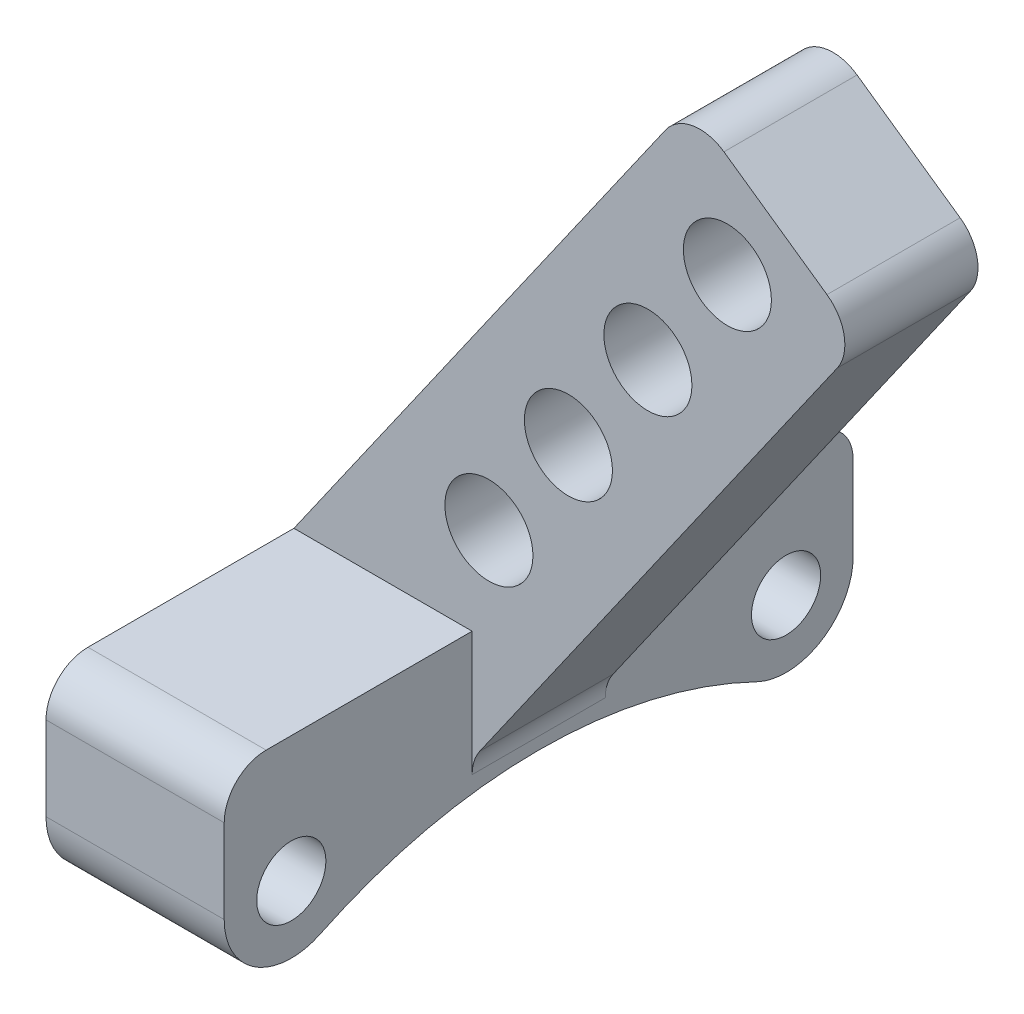
ISO-10303-21;
HEADER;
FILE_DESCRIPTION(('STEP AP214'),'2;1');
FILE_NAME('part.step','',(''),(''),'','','');
FILE_SCHEMA(('AUTOMOTIVE_DESIGN { 1 0 10303 214 1 1 1 1 }'));
ENDSEC;
DATA;
#1=APPLICATION_CONTEXT('core data for automotive mechanical design processes');
#2=APPLICATION_PROTOCOL_DEFINITION('international standard','automotive_design',2000,#1);
#3=PRODUCT_CONTEXT('',#1,'mechanical');
#4=PRODUCT('Part','Part','',(#3));
#5=PRODUCT_RELATED_PRODUCT_CATEGORY('part','',(#4));
#6=PRODUCT_DEFINITION_FORMATION('','',#4);
#7=PRODUCT_DEFINITION_CONTEXT('part definition',#1,'design');
#8=PRODUCT_DEFINITION('design','',#6,#7);
#9=PRODUCT_DEFINITION_SHAPE('','',#8);
#10=(LENGTH_UNIT() NAMED_UNIT(*) SI_UNIT(.MILLI.,.METRE.));
#11=(NAMED_UNIT(*) PLANE_ANGLE_UNIT() SI_UNIT($,.RADIAN.));
#12=(NAMED_UNIT(*) SI_UNIT($,.STERADIAN.) SOLID_ANGLE_UNIT());
#13=UNCERTAINTY_MEASURE_WITH_UNIT(LENGTH_MEASURE(1.E-05),#10,'distance_accuracy_value','');
#14=(GEOMETRIC_REPRESENTATION_CONTEXT(3) GLOBAL_UNCERTAINTY_ASSIGNED_CONTEXT((#13)) GLOBAL_UNIT_ASSIGNED_CONTEXT((#10,
#11,#12)) REPRESENTATION_CONTEXT('',''));
#15=CARTESIAN_POINT('',(0.,0.,0.));
#16=DIRECTION('',(0.,0.,1.));
#17=DIRECTION('',(1.,0.,0.));
#18=AXIS2_PLACEMENT_3D('',#15,#16,#17);
#19=CARTESIAN_POINT('',(8.5,6.,0.));
#20=DIRECTION('',(0.,1.,0.));
#21=DIRECTION('',(0.,0.,1.));
#22=AXIS2_PLACEMENT_3D('',#19,#20,#21);
#23=PLANE('',#22);
#24=DIRECTION('',(0.,0.,-1.));
#25=VECTOR('',#24,1.);
#26=CARTESIAN_POINT('',(8.5,6.,0.));
#27=LINE('',#26,#25);
#28=CARTESIAN_POINT('',(8.5,6.,13.));
#29=VERTEX_POINT('',#28);
#30=CARTESIAN_POINT('',(8.5,6.,3.175));
#31=VERTEX_POINT('',#30);
#32=EDGE_CURVE('E186',#29,#31,#27,.T.);
#33=ORIENTED_EDGE('',*,*,#32,.T.);
#34=DIRECTION('',(-1.,0.,0.));
#35=VECTOR('',#34,1.);
#36=CARTESIAN_POINT('',(8.5,6.,3.175));
#37=LINE('',#36,#35);
#38=CARTESIAN_POINT('',(0.,6.,3.175));
#39=VERTEX_POINT('',#38);
#40=EDGE_CURVE('E196',#31,#39,#37,.T.);
#41=ORIENTED_EDGE('',*,*,#40,.T.);
#42=DIRECTION('',(0.,0.,-1.));
#43=VECTOR('',#42,1.);
#44=CARTESIAN_POINT('',(0.,6.,0.));
#45=LINE('',#44,#43);
#46=CARTESIAN_POINT('',(0.,6.,13.));
#47=VERTEX_POINT('',#46);
#48=EDGE_CURVE('E200',#47,#39,#45,.T.);
#49=ORIENTED_EDGE('',*,*,#48,.F.);
#50=DIRECTION('',(-1.,0.,0.));
#51=VECTOR('',#50,1.);
#52=CARTESIAN_POINT('',(8.5,6.,13.));
#53=LINE('',#52,#51);
#54=EDGE_CURVE('E215',#29,#47,#53,.T.);
#55=ORIENTED_EDGE('',*,*,#54,.F.);
#56=EDGE_LOOP('',(#33,#41,#49,#55));
#57=FACE_BOUND('',#56,.T.);
#58=ADVANCED_FACE('F41',(#57),#23,.T.);
#59=CARTESIAN_POINT('',(8.5,0.,0.));
#60=DIRECTION('',(1.,0.,0.));
#61=DIRECTION('',(0.,0.,-1.));
#62=AXIS2_PLACEMENT_3D('',#59,#60,#61);
#63=PLANE('',#62);
#64=CARTESIAN_POINT('',(8.5,0.,11.8));
#65=DIRECTION('',(-1.,0.,0.));
#66=DIRECTION('',(0.,0.,1.));
#67=AXIS2_PLACEMENT_3D('',#64,#65,#66);
#68=CIRCLE('',#67,3.19999999999999);
#69=CARTESIAN_POINT('',(8.5,-2.88159421278918,10.4084487818194));
#70=VERTEX_POINT('',#69);
#71=CARTESIAN_POINT('',(8.5,0.,15.));
#72=VERTEX_POINT('',#71);
#73=EDGE_CURVE('E153',#70,#72,#68,.T.);
#74=ORIENTED_EDGE('',*,*,#73,.F.);
#75=CARTESIAN_POINT('',(8.5,-24.4351851851853,0.));
#76=DIRECTION('',(1.,0.,0.));
#77=DIRECTION('',(0.,0.,1.));
#78=AXIS2_PLACEMENT_3D('',#75,#76,#77);
#79=CIRCLE('',#78,23.9351851851853);
#80=CARTESIAN_POINT('',(8.5,-2.88159421278918,-10.4084487818194));
#81=VERTEX_POINT('',#80);
#82=EDGE_CURVE('E173',#81,#70,#79,.T.);
#83=ORIENTED_EDGE('',*,*,#82,.F.);
#84=CARTESIAN_POINT('',(8.5,0.,-11.8));
#85=DIRECTION('',(-1.,0.,0.));
#86=DIRECTION('',(0.,0.,1.));
#87=AXIS2_PLACEMENT_3D('',#84,#85,#86);
#88=CIRCLE('',#87,3.19999999999999);
#89=CARTESIAN_POINT('',(8.5,0.,-15.));
#90=VERTEX_POINT('',#89);
#91=EDGE_CURVE('E163',#90,#81,#88,.T.);
#92=ORIENTED_EDGE('',*,*,#91,.F.);
#93=DIRECTION('',(0.,1.,0.));
#94=VECTOR('',#93,1.);
#95=CARTESIAN_POINT('',(8.5,0.,-15.));
#96=LINE('',#95,#94);
#97=CARTESIAN_POINT('',(8.5,4.,-15.));
#98=VERTEX_POINT('',#97);
#99=EDGE_CURVE('E213',#90,#98,#96,.T.);
#100=ORIENTED_EDGE('',*,*,#99,.T.);
#101=CARTESIAN_POINT('',(8.5,4.,-13.));
#102=DIRECTION('',(1.,0.,0.));
#103=DIRECTION('',(0.,0.,-1.));
#104=AXIS2_PLACEMENT_3D('',#101,#102,#103);
#105=CIRCLE('',#104,2.);
#106=CARTESIAN_POINT('',(8.5,6.,-13.));
#107=VERTEX_POINT('',#106);
#108=EDGE_CURVE('E317',#98,#107,#105,.T.);
#109=ORIENTED_EDGE('',*,*,#108,.T.);
#110=CARTESIAN_POINT('',(8.5,6.,-3.175));
#111=VERTEX_POINT('',#110);
#112=EDGE_CURVE('E319',#111,#107,#27,.T.);
#113=ORIENTED_EDGE('',*,*,#112,.F.);
#114=DIRECTION('',(0.,1.,0.));
#115=VECTOR('',#114,1.);
#116=CARTESIAN_POINT('',(8.5,0.,-3.175));
#117=LINE('',#116,#115);
#118=CARTESIAN_POINT('',(8.5,0.0741925233390714,-3.175));
#119=VERTEX_POINT('',#118);
#120=EDGE_CURVE('E306',#119,#111,#117,.T.);
#121=ORIENTED_EDGE('',*,*,#120,.F.);
#122=DIRECTION('',(0.,0.,1.));
#123=VECTOR('',#122,1.);
#124=CARTESIAN_POINT('',(8.5,0.0741925233390714,0.));
#125=LINE('',#124,#123);
#126=CARTESIAN_POINT('',(8.5,0.0741925233390714,3.175));
#127=VERTEX_POINT('',#126);
#128=EDGE_CURVE('E223',#119,#127,#125,.T.);
#129=ORIENTED_EDGE('',*,*,#128,.T.);
#130=DIRECTION('',(0.,1.,0.));
#131=VECTOR('',#130,1.);
#132=CARTESIAN_POINT('',(8.5,0.,3.175));
#133=LINE('',#132,#131);
#134=EDGE_CURVE('E311',#127,#31,#133,.T.);
#135=ORIENTED_EDGE('',*,*,#134,.T.);
#136=ORIENTED_EDGE('',*,*,#32,.F.);
#137=CARTESIAN_POINT('',(8.5,4.,13.));
#138=DIRECTION('',(1.,0.,0.));
#139=DIRECTION('',(0.,0.,-1.));
#140=AXIS2_PLACEMENT_3D('',#137,#138,#139);
#141=CIRCLE('',#140,2.);
#142=CARTESIAN_POINT('',(8.5,4.,15.));
#143=VERTEX_POINT('',#142);
#144=EDGE_CURVE('E180',#143,#29,#141,.F.);
#145=ORIENTED_EDGE('',*,*,#144,.F.);
#146=DIRECTION('',(0.,1.,0.));
#147=VECTOR('',#146,1.);
#148=CARTESIAN_POINT('',(8.5,0.,15.));
#149=LINE('',#148,#147);
#150=EDGE_CURVE('E169',#72,#143,#149,.T.);
#151=ORIENTED_EDGE('',*,*,#150,.F.);
#152=EDGE_LOOP('',(#74,#83,#92,#100,#109,#113,#121,#129,#135,#136,#145,#151));
#153=FACE_BOUND('',#152,.T.);
#154=CARTESIAN_POINT('',(8.5,0.,-11.8));
#155=DIRECTION('',(1.,0.,0.));
#156=DIRECTION('',(0.,0.,-1.));
#157=AXIS2_PLACEMENT_3D('',#154,#155,#156);
#158=CIRCLE('',#157,1.65);
#159=CARTESIAN_POINT('',(8.5,0.,-13.45));
#160=VERTEX_POINT('',#159);
#161=EDGE_CURVE('E181',#160,#160,#158,.T.);
#162=ORIENTED_EDGE('',*,*,#161,.F.);
#163=EDGE_LOOP('',(#162));
#164=FACE_BOUND('',#163,.T.);
#165=CARTESIAN_POINT('',(8.5,0.,11.8));
#166=DIRECTION('',(1.,0.,0.));
#167=DIRECTION('',(0.,0.,-1.));
#168=AXIS2_PLACEMENT_3D('',#165,#166,#167);
#169=CIRCLE('',#168,1.65);
#170=CARTESIAN_POINT('',(8.5,0.,10.15));
#171=VERTEX_POINT('',#170);
#172=EDGE_CURVE('E184',#171,#171,#169,.T.);
#173=ORIENTED_EDGE('',*,*,#172,.F.);
#174=EDGE_LOOP('',(#173));
#175=FACE_BOUND('',#174,.T.);
#176=ADVANCED_FACE('F176',(#153,#164,#175),#63,.T.);
#177=CARTESIAN_POINT('',(8.5,0.,-15.));
#178=DIRECTION('',(0.,0.,1.));
#179=DIRECTION('',(1.,0.,0.));
#180=AXIS2_PLACEMENT_3D('',#177,#178,#179);
#181=PLANE('',#180);
#182=ORIENTED_EDGE('',*,*,#99,.F.);
#183=DIRECTION('',(1.,0.,0.));
#184=VECTOR('',#183,1.);
#185=CARTESIAN_POINT('',(-1.5,0.,-15.));
#186=LINE('',#185,#184);
#187=CARTESIAN_POINT('',(0.,0.,-15.));
#188=VERTEX_POINT('',#187);
#189=EDGE_CURVE('E172',#188,#90,#186,.T.);
#190=ORIENTED_EDGE('',*,*,#189,.F.);
#191=DIRECTION('',(0.,1.,0.));
#192=VECTOR('',#191,1.);
#193=CARTESIAN_POINT('',(0.,0.,-15.));
#194=LINE('',#193,#192);
#195=CARTESIAN_POINT('',(0.,4.,-15.));
#196=VERTEX_POINT('',#195);
#197=EDGE_CURVE('E193',#188,#196,#194,.T.);
#198=ORIENTED_EDGE('',*,*,#197,.T.);
#199=DIRECTION('',(-1.,0.,0.));
#200=VECTOR('',#199,1.);
#201=CARTESIAN_POINT('',(8.5,4.,-15.));
#202=LINE('',#201,#200);
#203=EDGE_CURVE('E220',#98,#196,#202,.T.);
#204=ORIENTED_EDGE('',*,*,#203,.F.);
#205=EDGE_LOOP('',(#182,#190,#198,#204));
#206=FACE_BOUND('',#205,.T.);
#207=ADVANCED_FACE('F383',(#206),#181,.F.);
#208=CARTESIAN_POINT('',(8.5,4.,-13.));
#209=DIRECTION('',(-1.,0.,0.));
#210=DIRECTION('',(0.,0.,1.));
#211=AXIS2_PLACEMENT_3D('',#208,#209,#210);
#212=CYLINDRICAL_SURFACE('',#211,2.);
#213=CARTESIAN_POINT('',(0.,4.,-13.));
#214=DIRECTION('',(1.,0.,0.));
#215=DIRECTION('',(0.,0.,-1.));
#216=AXIS2_PLACEMENT_3D('',#213,#214,#215);
#217=CIRCLE('',#216,2.);
#218=CARTESIAN_POINT('',(0.,6.,-13.));
#219=VERTEX_POINT('',#218);
#220=EDGE_CURVE('E195',#196,#219,#217,.T.);
#221=ORIENTED_EDGE('',*,*,#220,.T.);
#222=DIRECTION('',(-1.,0.,0.));
#223=VECTOR('',#222,1.);
#224=CARTESIAN_POINT('',(8.5,6.,-13.));
#225=LINE('',#224,#223);
#226=EDGE_CURVE('E217',#107,#219,#225,.T.);
#227=ORIENTED_EDGE('',*,*,#226,.F.);
#228=ORIENTED_EDGE('',*,*,#108,.F.);
#229=ORIENTED_EDGE('',*,*,#203,.T.);
#230=EDGE_LOOP('',(#221,#227,#228,#229));
#231=FACE_BOUND('',#230,.T.);
#232=ADVANCED_FACE('F333',(#231),#212,.T.);
#233=DIRECTION('',(-1.,0.,0.));
#234=VECTOR('',#233,1.);
#235=CARTESIAN_POINT('',(8.5,6.,-3.175));
#236=LINE('',#235,#234);
#237=CARTESIAN_POINT('',(0.,6.,-3.175));
#238=VERTEX_POINT('',#237);
#239=EDGE_CURVE('E308',#111,#238,#236,.T.);
#240=ORIENTED_EDGE('',*,*,#239,.F.);
#241=ORIENTED_EDGE('',*,*,#112,.T.);
#242=ORIENTED_EDGE('',*,*,#226,.T.);
#243=EDGE_CURVE('E199',#238,#219,#45,.T.);
#244=ORIENTED_EDGE('',*,*,#243,.F.);
#245=EDGE_LOOP('',(#240,#241,#242,#244));
#246=FACE_BOUND('',#245,.T.);
#247=ADVANCED_FACE('F325',(#246),#23,.T.);
#248=CARTESIAN_POINT('',(8.5,4.,13.));
#249=DIRECTION('',(-1.,0.,0.));
#250=DIRECTION('',(0.,0.,1.));
#251=AXIS2_PLACEMENT_3D('',#248,#249,#250);
#252=CYLINDRICAL_SURFACE('',#251,2.);
#253=CARTESIAN_POINT('',(0.,4.,13.));
#254=DIRECTION('',(1.,0.,0.));
#255=DIRECTION('',(0.,0.,-1.));
#256=AXIS2_PLACEMENT_3D('',#253,#254,#255);
#257=CIRCLE('',#256,2.);
#258=CARTESIAN_POINT('',(0.,4.,15.));
#259=VERTEX_POINT('',#258);
#260=EDGE_CURVE('E203',#259,#47,#257,.F.);
#261=ORIENTED_EDGE('',*,*,#260,.F.);
#262=DIRECTION('',(-1.,0.,0.));
#263=VECTOR('',#262,1.);
#264=CARTESIAN_POINT('',(8.5,4.,15.));
#265=LINE('',#264,#263);
#266=EDGE_CURVE('E192',#143,#259,#265,.T.);
#267=ORIENTED_EDGE('',*,*,#266,.F.);
#268=ORIENTED_EDGE('',*,*,#144,.T.);
#269=ORIENTED_EDGE('',*,*,#54,.T.);
#270=EDGE_LOOP('',(#261,#267,#268,#269));
#271=FACE_BOUND('',#270,.T.);
#272=ADVANCED_FACE('F388',(#271),#252,.T.);
#273=CARTESIAN_POINT('',(8.5,0.,15.));
#274=DIRECTION('',(0.,0.,1.));
#275=DIRECTION('',(0.,-1.,0.));
#276=AXIS2_PLACEMENT_3D('',#273,#274,#275);
#277=PLANE('',#276);
#278=DIRECTION('',(1.,0.,0.));
#279=VECTOR('',#278,1.);
#280=CARTESIAN_POINT('',(-1.5,0.,15.));
#281=LINE('',#280,#279);
#282=CARTESIAN_POINT('',(0.,0.,15.));
#283=VERTEX_POINT('',#282);
#284=EDGE_CURVE('E156',#283,#72,#281,.T.);
#285=ORIENTED_EDGE('',*,*,#284,.T.);
#286=ORIENTED_EDGE('',*,*,#150,.T.);
#287=ORIENTED_EDGE('',*,*,#266,.T.);
#288=DIRECTION('',(0.,1.,0.));
#289=VECTOR('',#288,1.);
#290=CARTESIAN_POINT('',(0.,0.,15.));
#291=LINE('',#290,#289);
#292=EDGE_CURVE('E171',#283,#259,#291,.T.);
#293=ORIENTED_EDGE('',*,*,#292,.F.);
#294=EDGE_LOOP('',(#285,#286,#287,#293));
#295=FACE_BOUND('',#294,.T.);
#296=ADVANCED_FACE('F167',(#295),#277,.T.);
#297=CARTESIAN_POINT('',(8.5,0.,-11.8));
#298=DIRECTION('',(-1.,0.,0.));
#299=DIRECTION('',(0.,0.,1.));
#300=AXIS2_PLACEMENT_3D('',#297,#298,#299);
#301=CYLINDRICAL_SURFACE('',#300,1.65);
#302=ORIENTED_EDGE('',*,*,#161,.T.);
#303=EDGE_LOOP('',(#302));
#304=FACE_BOUND('',#303,.T.);
#305=CARTESIAN_POINT('',(0.,0.,-11.8));
#306=DIRECTION('',(1.,0.,0.));
#307=DIRECTION('',(0.,0.,-1.));
#308=AXIS2_PLACEMENT_3D('',#305,#306,#307);
#309=CIRCLE('',#308,1.65);
#310=CARTESIAN_POINT('',(0.,0.,-13.45));
#311=VERTEX_POINT('',#310);
#312=EDGE_CURVE('E207',#311,#311,#309,.T.);
#313=ORIENTED_EDGE('',*,*,#312,.F.);
#314=EDGE_LOOP('',(#313));
#315=FACE_BOUND('',#314,.T.);
#316=ADVANCED_FACE('F449',(#304,#315),#301,.F.);
#317=CARTESIAN_POINT('',(8.5,0.,11.8));
#318=DIRECTION('',(-1.,0.,0.));
#319=DIRECTION('',(0.,0.,1.));
#320=AXIS2_PLACEMENT_3D('',#317,#318,#319);
#321=CYLINDRICAL_SURFACE('',#320,1.65);
#322=ORIENTED_EDGE('',*,*,#172,.T.);
#323=EDGE_LOOP('',(#322));
#324=FACE_BOUND('',#323,.T.);
#325=CARTESIAN_POINT('',(0.,0.,11.8));
#326=DIRECTION('',(1.,0.,0.));
#327=DIRECTION('',(0.,0.,-1.));
#328=AXIS2_PLACEMENT_3D('',#325,#326,#327);
#329=CIRCLE('',#328,1.65);
#330=CARTESIAN_POINT('',(0.,0.,10.15));
#331=VERTEX_POINT('',#330);
#332=EDGE_CURVE('E210',#331,#331,#329,.T.);
#333=ORIENTED_EDGE('',*,*,#332,.F.);
#334=EDGE_LOOP('',(#333));
#335=FACE_BOUND('',#334,.T.);
#336=ADVANCED_FACE('F446',(#324,#335),#321,.F.);
#337=CARTESIAN_POINT('',(0.,0.,0.));
#338=DIRECTION('',(1.,0.,0.));
#339=DIRECTION('',(0.,0.,-1.));
#340=AXIS2_PLACEMENT_3D('',#337,#338,#339);
#341=PLANE('',#340);
#342=CARTESIAN_POINT('',(0.,-24.4351851851853,0.));
#343=DIRECTION('',(1.,0.,0.));
#344=DIRECTION('',(0.,0.,-1.));
#345=AXIS2_PLACEMENT_3D('',#342,#343,#344);
#346=CIRCLE('',#345,23.9351851851853);
#347=CARTESIAN_POINT('',(0.,-2.88159421278918,-10.4084487818194));
#348=VERTEX_POINT('',#347);
#349=CARTESIAN_POINT('',(0.,-2.88159421278918,10.4084487818194));
#350=VERTEX_POINT('',#349);
#351=EDGE_CURVE('E49',#348,#350,#346,.T.);
#352=ORIENTED_EDGE('',*,*,#351,.T.);
#353=CARTESIAN_POINT('',(0.,0.,11.8));
#354=DIRECTION('',(1.,0.,0.));
#355=DIRECTION('',(0.,0.,-1.));
#356=AXIS2_PLACEMENT_3D('',#353,#354,#355);
#357=CIRCLE('',#356,3.19999999999999);
#358=EDGE_CURVE('E11',#350,#283,#357,.F.);
#359=ORIENTED_EDGE('',*,*,#358,.T.);
#360=ORIENTED_EDGE('',*,*,#292,.T.);
#361=ORIENTED_EDGE('',*,*,#260,.T.);
#362=ORIENTED_EDGE('',*,*,#48,.T.);
#363=DIRECTION('',(0.,0.,-1.));
#364=VECTOR('',#363,1.);
#365=CARTESIAN_POINT('',(0.,6.,3.175));
#366=LINE('',#365,#364);
#367=EDGE_CURVE('E283',#39,#238,#366,.T.);
#368=ORIENTED_EDGE('',*,*,#367,.T.);
#369=ORIENTED_EDGE('',*,*,#243,.T.);
#370=ORIENTED_EDGE('',*,*,#220,.F.);
#371=ORIENTED_EDGE('',*,*,#197,.F.);
#372=CARTESIAN_POINT('',(0.,0.,-11.8));
#373=DIRECTION('',(1.,0.,0.));
#374=DIRECTION('',(0.,0.,-1.));
#375=AXIS2_PLACEMENT_3D('',#372,#373,#374);
#376=CIRCLE('',#375,3.19999999999999);
#377=EDGE_CURVE('E232',#188,#348,#376,.F.);
#378=ORIENTED_EDGE('',*,*,#377,.T.);
#379=EDGE_LOOP('',(#352,#359,#360,#361,#362,#368,#369,#370,#371,#378));
#380=FACE_BOUND('',#379,.T.);
#381=ORIENTED_EDGE('',*,*,#332,.T.);
#382=EDGE_LOOP('',(#381));
#383=FACE_BOUND('',#382,.T.);
#384=ORIENTED_EDGE('',*,*,#312,.T.);
#385=EDGE_LOOP('',(#384));
#386=FACE_BOUND('',#385,.T.);
#387=ADVANCED_FACE('F236',(#380,#383,#386),#341,.F.);
#388=CARTESIAN_POINT('',(19.3649131176615,30.1690684784805,3.175));
#389=DIRECTION('',(0.,0.,-1.));
#390=DIRECTION('',(-1.,0.,0.));
#391=AXIS2_PLACEMENT_3D('',#388,#389,#390);
#392=PLANE('',#391);
#393=ORIENTED_EDGE('',*,*,#40,.F.);
#394=ORIENTED_EDGE('',*,*,#134,.F.);
#395=CARTESIAN_POINT('',(10.5,0.0741925233390714,3.175));
#396=DIRECTION('',(0.,0.,-1.));
#397=DIRECTION('',(-1.,0.,0.));
#398=AXIS2_PLACEMENT_3D('',#395,#396,#397);
#399=CIRCLE('',#398,2.);
#400=CARTESIAN_POINT('',(8.86169591142201,1.22134539604116,3.175));
#401=VERTEX_POINT('',#400);
#402=EDGE_CURVE('E64',#127,#401,#399,.T.);
#403=ORIENTED_EDGE('',*,*,#402,.T.);
#404=DIRECTION('',(0.573576436351044,0.819152044288993,0.));
#405=VECTOR('',#404,1.);
#406=CARTESIAN_POINT('',(25.9181294719735,25.5804569876722,3.175));
#407=LINE('',#406,#405);
#408=CARTESIAN_POINT('',(25.9181294719735,25.5804569876722,3.175));
#409=VERTEX_POINT('',#408);
#410=EDGE_CURVE('E272',#401,#409,#407,.T.);
#411=ORIENTED_EDGE('',*,*,#410,.T.);
#412=CARTESIAN_POINT('',(24.2798253833955,26.7276098603743,3.175));
#413=DIRECTION('',(0.,0.,1.));
#414=DIRECTION('',(1.,0.,0.));
#415=AXIS2_PLACEMENT_3D('',#412,#413,#414);
#416=CIRCLE('',#415,1.99999999999999);
#417=CARTESIAN_POINT('',(25.4269782560976,28.3659139489522,3.175));
#418=VERTEX_POINT('',#417);
#419=EDGE_CURVE('E274',#409,#418,#416,.T.);
#420=ORIENTED_EDGE('',*,*,#419,.T.);
#421=DIRECTION('',(-0.819152044288993,0.573576436351044,0.));
#422=VECTOR('',#421,1.);
#423=CARTESIAN_POINT('',(25.4269782560976,28.3659139489522,3.175));
#424=LINE('',#423,#422);
#425=CARTESIAN_POINT('',(20.5120659903636,31.8073725670585,3.175));
#426=VERTEX_POINT('',#425);
#427=EDGE_CURVE('E277',#418,#426,#424,.T.);
#428=ORIENTED_EDGE('',*,*,#427,.T.);
#429=CARTESIAN_POINT('',(19.3649131176615,30.1690684784805,3.175));
#430=DIRECTION('',(0.,0.,1.));
#431=DIRECTION('',(-1.,0.,0.));
#432=AXIS2_PLACEMENT_3D('',#429,#430,#431);
#433=CIRCLE('',#432,1.99999999999999);
#434=CARTESIAN_POINT('',(17.7266090290836,31.3162213511826,3.175));
#435=VERTEX_POINT('',#434);
#436=EDGE_CURVE('E279',#426,#435,#433,.T.);
#437=ORIENTED_EDGE('',*,*,#436,.T.);
#438=DIRECTION('',(-0.573576436351044,-0.819152044288993,0.));
#439=VECTOR('',#438,1.);
#440=CARTESIAN_POINT('',(0.,6.,3.175));
#441=LINE('',#440,#439);
#442=EDGE_CURVE('E281',#435,#39,#441,.T.);
#443=ORIENTED_EDGE('',*,*,#442,.T.);
#444=EDGE_LOOP('',(#393,#394,#403,#411,#420,#428,#437,#443));
#445=FACE_BOUND('',#444,.T.);
#446=CARTESIAN_POINT('',(13.0925358892656,15.9808450553489,3.175));
#447=DIRECTION('',(0.,0.,1.));
#448=DIRECTION('',(1.,0.,0.));
#449=AXIS2_PLACEMENT_3D('',#446,#447,#448);
#450=CIRCLE('',#449,2.1);
#451=CARTESIAN_POINT('',(15.1925358892656,15.9808450553489,3.175));
#452=VERTEX_POINT('',#451);
#453=EDGE_CURVE('E266',#452,#452,#450,.T.);
#454=ORIENTED_EDGE('',*,*,#453,.F.);
#455=EDGE_LOOP('',(#454));
#456=FACE_BOUND('',#455,.T.);
#457=CARTESIAN_POINT('',(20.6752163778264,26.8100350808494,3.175));
#458=DIRECTION('',(0.,0.,1.));
#459=DIRECTION('',(1.,0.,0.));
#460=AXIS2_PLACEMENT_3D('',#457,#458,#459);
#461=CIRCLE('',#460,2.1);
#462=CARTESIAN_POINT('',(22.7752163778264,26.8100350808494,3.175));
#463=VERTEX_POINT('',#462);
#464=EDGE_CURVE('E260',#463,#463,#461,.T.);
#465=ORIENTED_EDGE('',*,*,#464,.F.);
#466=EDGE_LOOP('',(#465));
#467=FACE_BOUND('',#466,.T.);
#468=CARTESIAN_POINT('',(16.883876133546,21.3954400680992,3.175));
#469=DIRECTION('',(0.,0.,1.));
#470=DIRECTION('',(1.,0.,0.));
#471=AXIS2_PLACEMENT_3D('',#468,#469,#470);
#472=CIRCLE('',#471,2.1);
#473=CARTESIAN_POINT('',(18.983876133546,21.3954400680992,3.175));
#474=VERTEX_POINT('',#473);
#475=EDGE_CURVE('E254',#474,#474,#472,.T.);
#476=ORIENTED_EDGE('',*,*,#475,.F.);
#477=EDGE_LOOP('',(#476));
#478=FACE_BOUND('',#477,.T.);
#479=CARTESIAN_POINT('',(9.30119564498523,10.5662500425987,3.175));
#480=DIRECTION('',(0.,0.,1.));
#481=DIRECTION('',(1.,0.,0.));
#482=AXIS2_PLACEMENT_3D('',#479,#480,#481);
#483=CIRCLE('',#482,2.1);
#484=CARTESIAN_POINT('',(11.4011956449852,10.5662500425987,3.175));
#485=VERTEX_POINT('',#484);
#486=EDGE_CURVE('E244',#485,#485,#483,.T.);
#487=ORIENTED_EDGE('',*,*,#486,.F.);
#488=EDGE_LOOP('',(#487));
#489=FACE_BOUND('',#488,.T.);
#490=ADVANCED_FACE('F341',(#445,#456,#467,#478,#489),#392,.F.);
#491=CARTESIAN_POINT('',(19.3649131176615,30.1690684784805,-3.175));
#492=DIRECTION('',(0.,0.,-1.));
#493=DIRECTION('',(-1.,0.,0.));
#494=AXIS2_PLACEMENT_3D('',#491,#492,#493);
#495=PLANE('',#494);
#496=CARTESIAN_POINT('',(16.883876133546,21.3954400680992,-3.175));
#497=DIRECTION('',(0.,0.,1.));
#498=DIRECTION('',(1.,0.,0.));
#499=AXIS2_PLACEMENT_3D('',#496,#497,#498);
#500=CIRCLE('',#499,2.1);
#501=CARTESIAN_POINT('',(18.983876133546,21.3954400680992,-3.175));
#502=VERTEX_POINT('',#501);
#503=EDGE_CURVE('E252',#502,#502,#500,.T.);
#504=ORIENTED_EDGE('',*,*,#503,.T.);
#505=EDGE_LOOP('',(#504));
#506=FACE_BOUND('',#505,.T.);
#507=CARTESIAN_POINT('',(13.0925358892656,15.9808450553489,-3.175));
#508=DIRECTION('',(0.,0.,1.));
#509=DIRECTION('',(1.,0.,0.));
#510=AXIS2_PLACEMENT_3D('',#507,#508,#509);
#511=CIRCLE('',#510,2.1);
#512=CARTESIAN_POINT('',(15.1925358892656,15.9808450553489,-3.175));
#513=VERTEX_POINT('',#512);
#514=EDGE_CURVE('E263',#513,#513,#511,.T.);
#515=ORIENTED_EDGE('',*,*,#514,.T.);
#516=EDGE_LOOP('',(#515));
#517=FACE_BOUND('',#516,.T.);
#518=ORIENTED_EDGE('',*,*,#120,.T.);
#519=ORIENTED_EDGE('',*,*,#239,.T.);
#520=DIRECTION('',(-0.573576436351044,-0.819152044288993,0.));
#521=VECTOR('',#520,1.);
#522=CARTESIAN_POINT('',(0.,6.,-3.175));
#523=LINE('',#522,#521);
#524=CARTESIAN_POINT('',(17.7266090290836,31.3162213511826,-3.175));
#525=VERTEX_POINT('',#524);
#526=EDGE_CURVE('E275',#525,#238,#523,.T.);
#527=ORIENTED_EDGE('',*,*,#526,.F.);
#528=CARTESIAN_POINT('',(19.3649131176615,30.1690684784805,-3.175));
#529=DIRECTION('',(0.,0.,1.));
#530=DIRECTION('',(-1.,0.,0.));
#531=AXIS2_PLACEMENT_3D('',#528,#529,#530);
#532=CIRCLE('',#531,1.99999999999999);
#533=CARTESIAN_POINT('',(20.5120659903636,31.8073725670585,-3.175));
#534=VERTEX_POINT('',#533);
#535=EDGE_CURVE('E289',#534,#525,#532,.T.);
#536=ORIENTED_EDGE('',*,*,#535,.F.);
#537=DIRECTION('',(-0.819152044288993,0.573576436351044,0.));
#538=VECTOR('',#537,1.);
#539=CARTESIAN_POINT('',(25.4269782560976,28.3659139489522,-3.175));
#540=LINE('',#539,#538);
#541=CARTESIAN_POINT('',(25.4269782560976,28.3659139489522,-3.175));
#542=VERTEX_POINT('',#541);
#543=EDGE_CURVE('E287',#542,#534,#540,.T.);
#544=ORIENTED_EDGE('',*,*,#543,.F.);
#545=CARTESIAN_POINT('',(24.2798253833955,26.7276098603743,-3.175));
#546=DIRECTION('',(0.,0.,1.));
#547=DIRECTION('',(1.,0.,0.));
#548=AXIS2_PLACEMENT_3D('',#545,#546,#547);
#549=CIRCLE('',#548,1.99999999999999);
#550=CARTESIAN_POINT('',(25.9181294719735,25.5804569876722,-3.175));
#551=VERTEX_POINT('',#550);
#552=EDGE_CURVE('E285',#551,#542,#549,.T.);
#553=ORIENTED_EDGE('',*,*,#552,.F.);
#554=DIRECTION('',(0.573576436351044,0.819152044288993,0.));
#555=VECTOR('',#554,1.);
#556=CARTESIAN_POINT('',(25.9181294719735,25.5804569876722,-3.175));
#557=LINE('',#556,#555);
#558=CARTESIAN_POINT('',(8.86169591142201,1.22134539604116,-3.175));
#559=VERTEX_POINT('',#558);
#560=EDGE_CURVE('E269',#559,#551,#557,.T.);
#561=ORIENTED_EDGE('',*,*,#560,.F.);
#562=CARTESIAN_POINT('',(10.5,0.0741925233390714,-3.175));
#563=DIRECTION('',(0.,0.,-1.));
#564=DIRECTION('',(-1.,0.,0.));
#565=AXIS2_PLACEMENT_3D('',#562,#563,#564);
#566=CIRCLE('',#565,2.);
#567=EDGE_CURVE('E229',#559,#119,#566,.F.);
#568=ORIENTED_EDGE('',*,*,#567,.T.);
#569=EDGE_LOOP('',(#518,#519,#527,#536,#544,#553,#561,#568));
#570=FACE_BOUND('',#569,.T.);
#571=CARTESIAN_POINT('',(20.6752163778264,26.8100350808494,-3.175));
#572=DIRECTION('',(0.,0.,1.));
#573=DIRECTION('',(1.,0.,0.));
#574=AXIS2_PLACEMENT_3D('',#571,#572,#573);
#575=CIRCLE('',#574,2.1);
#576=CARTESIAN_POINT('',(22.7752163778264,26.8100350808494,-3.175));
#577=VERTEX_POINT('',#576);
#578=EDGE_CURVE('E257',#577,#577,#575,.T.);
#579=ORIENTED_EDGE('',*,*,#578,.T.);
#580=EDGE_LOOP('',(#579));
#581=FACE_BOUND('',#580,.T.);
#582=CARTESIAN_POINT('',(9.30119564498523,10.5662500425987,-3.175));
#583=DIRECTION('',(0.,0.,1.));
#584=DIRECTION('',(1.,0.,0.));
#585=AXIS2_PLACEMENT_3D('',#582,#583,#584);
#586=CIRCLE('',#585,2.1);
#587=CARTESIAN_POINT('',(11.4011956449852,10.5662500425987,-3.175));
#588=VERTEX_POINT('',#587);
#589=EDGE_CURVE('E241',#588,#588,#586,.T.);
#590=ORIENTED_EDGE('',*,*,#589,.T.);
#591=EDGE_LOOP('',(#590));
#592=FACE_BOUND('',#591,.T.);
#593=ADVANCED_FACE('F353',(#506,#517,#570,#581,#592),#495,.T.);
#594=CARTESIAN_POINT('',(25.9181294719735,25.5804569876722,3.175));
#595=DIRECTION('',(-0.819152044288993,0.573576436351044,0.));
#596=DIRECTION('',(-0.573576436351044,-0.819152044288993,0.));
#597=AXIS2_PLACEMENT_3D('',#594,#595,#596);
#598=PLANE('',#597);
#599=ORIENTED_EDGE('',*,*,#410,.F.);
#600=DIRECTION('',(0.,0.,1.));
#601=VECTOR('',#600,1.);
#602=CARTESIAN_POINT('',(8.86169591142201,1.22134539604116,3.175));
#603=LINE('',#602,#601);
#604=EDGE_CURVE('E226',#401,#559,#603,.F.);
#605=ORIENTED_EDGE('',*,*,#604,.T.);
#606=ORIENTED_EDGE('',*,*,#560,.T.);
#607=DIRECTION('',(0.,0.,-1.));
#608=VECTOR('',#607,1.);
#609=CARTESIAN_POINT('',(25.9181294719735,25.5804569876722,3.175));
#610=LINE('',#609,#608);
#611=EDGE_CURVE('E303',#409,#551,#610,.T.);
#612=ORIENTED_EDGE('',*,*,#611,.F.);
#613=EDGE_LOOP('',(#599,#605,#606,#612));
#614=FACE_BOUND('',#613,.T.);
#615=ADVANCED_FACE('F349',(#614),#598,.F.);
#616=CARTESIAN_POINT('',(24.2798253833955,26.7276098603743,3.175));
#617=DIRECTION('',(0.,0.,-1.));
#618=DIRECTION('',(-1.,0.,0.));
#619=AXIS2_PLACEMENT_3D('',#616,#617,#618);
#620=CYLINDRICAL_SURFACE('',#619,1.99999999999999);
#621=ORIENTED_EDGE('',*,*,#552,.T.);
#622=DIRECTION('',(0.,0.,-1.));
#623=VECTOR('',#622,1.);
#624=CARTESIAN_POINT('',(25.4269782560976,28.3659139489522,3.175));
#625=LINE('',#624,#623);
#626=EDGE_CURVE('E300',#418,#542,#625,.T.);
#627=ORIENTED_EDGE('',*,*,#626,.F.);
#628=ORIENTED_EDGE('',*,*,#419,.F.);
#629=ORIENTED_EDGE('',*,*,#611,.T.);
#630=EDGE_LOOP('',(#621,#627,#628,#629));
#631=FACE_BOUND('',#630,.T.);
#632=ADVANCED_FACE('F359',(#631),#620,.T.);
#633=CARTESIAN_POINT('',(25.4269782560976,28.3659139489522,3.175));
#634=DIRECTION('',(-0.573576436351044,-0.819152044288993,0.));
#635=DIRECTION('',(0.819152044288994,-0.573576436351044,0.));
#636=AXIS2_PLACEMENT_3D('',#633,#634,#635);
#637=PLANE('',#636);
#638=ORIENTED_EDGE('',*,*,#543,.T.);
#639=DIRECTION('',(0.,0.,-1.));
#640=VECTOR('',#639,1.);
#641=CARTESIAN_POINT('',(20.5120659903636,31.8073725670585,3.175));
#642=LINE('',#641,#640);
#643=EDGE_CURVE('E297',#426,#534,#642,.T.);
#644=ORIENTED_EDGE('',*,*,#643,.F.);
#645=ORIENTED_EDGE('',*,*,#427,.F.);
#646=ORIENTED_EDGE('',*,*,#626,.T.);
#647=EDGE_LOOP('',(#638,#644,#645,#646));
#648=FACE_BOUND('',#647,.T.);
#649=ADVANCED_FACE('F363',(#648),#637,.F.);
#650=CARTESIAN_POINT('',(19.3649131176615,30.1690684784805,3.175));
#651=DIRECTION('',(0.,0.,-1.));
#652=DIRECTION('',(-1.,0.,0.));
#653=AXIS2_PLACEMENT_3D('',#650,#651,#652);
#654=CYLINDRICAL_SURFACE('',#653,1.99999999999999);
#655=ORIENTED_EDGE('',*,*,#535,.T.);
#656=DIRECTION('',(0.,0.,-1.));
#657=VECTOR('',#656,1.);
#658=CARTESIAN_POINT('',(17.7266090290836,31.3162213511826,3.175));
#659=LINE('',#658,#657);
#660=EDGE_CURVE('E294',#435,#525,#659,.T.);
#661=ORIENTED_EDGE('',*,*,#660,.F.);
#662=ORIENTED_EDGE('',*,*,#436,.F.);
#663=ORIENTED_EDGE('',*,*,#643,.T.);
#664=EDGE_LOOP('',(#655,#661,#662,#663));
#665=FACE_BOUND('',#664,.T.);
#666=ADVANCED_FACE('F368',(#665),#654,.T.);
#667=CARTESIAN_POINT('',(0.,6.,3.175));
#668=DIRECTION('',(0.819152044288993,-0.573576436351044,0.));
#669=DIRECTION('',(0.573576436351044,0.819152044288994,0.));
#670=AXIS2_PLACEMENT_3D('',#667,#668,#669);
#671=PLANE('',#670);
#672=ORIENTED_EDGE('',*,*,#526,.T.);
#673=ORIENTED_EDGE('',*,*,#367,.F.);
#674=ORIENTED_EDGE('',*,*,#442,.F.);
#675=ORIENTED_EDGE('',*,*,#660,.T.);
#676=EDGE_LOOP('',(#672,#673,#674,#675));
#677=FACE_BOUND('',#676,.T.);
#678=ADVANCED_FACE('F339',(#677),#671,.F.);
#679=CARTESIAN_POINT('',(13.0925358892656,15.9808450553489,3.175));
#680=DIRECTION('',(0.,0.,-1.));
#681=DIRECTION('',(-1.,0.,0.));
#682=AXIS2_PLACEMENT_3D('',#679,#680,#681);
#683=CYLINDRICAL_SURFACE('',#682,2.1);
#684=ORIENTED_EDGE('',*,*,#453,.T.);
#685=EDGE_LOOP('',(#684));
#686=FACE_BOUND('',#685,.T.);
#687=ORIENTED_EDGE('',*,*,#514,.F.);
#688=EDGE_LOOP('',(#687));
#689=FACE_BOUND('',#688,.T.);
#690=ADVANCED_FACE('F375',(#686,#689),#683,.F.);
#691=CARTESIAN_POINT('',(20.6752163778264,26.8100350808494,3.175));
#692=DIRECTION('',(0.,0.,-1.));
#693=DIRECTION('',(-1.,0.,0.));
#694=AXIS2_PLACEMENT_3D('',#691,#692,#693);
#695=CYLINDRICAL_SURFACE('',#694,2.1);
#696=ORIENTED_EDGE('',*,*,#464,.T.);
#697=EDGE_LOOP('',(#696));
#698=FACE_BOUND('',#697,.T.);
#699=ORIENTED_EDGE('',*,*,#578,.F.);
#700=EDGE_LOOP('',(#699));
#701=FACE_BOUND('',#700,.T.);
#702=ADVANCED_FACE('F418',(#698,#701),#695,.F.);
#703=CARTESIAN_POINT('',(16.883876133546,21.3954400680992,3.175));
#704=DIRECTION('',(0.,0.,-1.));
#705=DIRECTION('',(-1.,0.,0.));
#706=AXIS2_PLACEMENT_3D('',#703,#704,#705);
#707=CYLINDRICAL_SURFACE('',#706,2.1);
#708=ORIENTED_EDGE('',*,*,#475,.T.);
#709=EDGE_LOOP('',(#708));
#710=FACE_BOUND('',#709,.T.);
#711=ORIENTED_EDGE('',*,*,#503,.F.);
#712=EDGE_LOOP('',(#711));
#713=FACE_BOUND('',#712,.T.);
#714=ADVANCED_FACE('F414',(#710,#713),#707,.F.);
#715=CARTESIAN_POINT('',(9.30119564498523,10.5662500425987,3.175));
#716=DIRECTION('',(0.,0.,-1.));
#717=DIRECTION('',(-1.,0.,0.));
#718=AXIS2_PLACEMENT_3D('',#715,#716,#717);
#719=CYLINDRICAL_SURFACE('',#718,2.1);
#720=ORIENTED_EDGE('',*,*,#486,.T.);
#721=EDGE_LOOP('',(#720));
#722=FACE_BOUND('',#721,.T.);
#723=ORIENTED_EDGE('',*,*,#589,.F.);
#724=EDGE_LOOP('',(#723));
#725=FACE_BOUND('',#724,.T.);
#726=ADVANCED_FACE('F411',(#722,#725),#719,.F.);
#727=CARTESIAN_POINT('',(10.5,0.0741925233390714,0.));
#728=DIRECTION('',(0.,0.,1.));
#729=DIRECTION('',(1.,0.,0.));
#730=AXIS2_PLACEMENT_3D('',#727,#728,#729);
#731=CYLINDRICAL_SURFACE('',#730,2.);
#732=ORIENTED_EDGE('',*,*,#567,.F.);
#733=ORIENTED_EDGE('',*,*,#604,.F.);
#734=ORIENTED_EDGE('',*,*,#402,.F.);
#735=ORIENTED_EDGE('',*,*,#128,.F.);
#736=EDGE_LOOP('',(#732,#733,#734,#735));
#737=FACE_BOUND('',#736,.T.);
#738=ADVANCED_FACE('F43',(#737),#731,.F.);
#739=CARTESIAN_POINT('',(-1.5,0.,11.8));
#740=DIRECTION('',(1.,0.,0.));
#741=DIRECTION('',(0.,0.,-1.));
#742=AXIS2_PLACEMENT_3D('',#739,#740,#741);
#743=CYLINDRICAL_SURFACE('',#742,3.19999999999999);
#744=DIRECTION('',(1.,0.,0.));
#745=VECTOR('',#744,1.);
#746=CARTESIAN_POINT('',(-1.5,-2.88159421278918,10.4084487818194));
#747=LINE('',#746,#745);
#748=EDGE_CURVE('E158',#350,#70,#747,.T.);
#749=ORIENTED_EDGE('',*,*,#748,.T.);
#750=ORIENTED_EDGE('',*,*,#73,.T.);
#751=ORIENTED_EDGE('',*,*,#284,.F.);
#752=ORIENTED_EDGE('',*,*,#358,.F.);
#753=EDGE_LOOP('',(#749,#750,#751,#752));
#754=FACE_BOUND('',#753,.T.);
#755=ADVANCED_FACE('F155',(#754),#743,.T.);
#756=CARTESIAN_POINT('',(-1.5,-24.4351851851853,0.));
#757=DIRECTION('',(1.,0.,0.));
#758=DIRECTION('',(0.,0.,-1.));
#759=AXIS2_PLACEMENT_3D('',#756,#757,#758);
#760=CYLINDRICAL_SURFACE('',#759,23.9351851851853);
#761=DIRECTION('',(1.,0.,0.));
#762=VECTOR('',#761,1.);
#763=CARTESIAN_POINT('',(-1.5,-2.88159421278918,-10.4084487818194));
#764=LINE('',#763,#762);
#765=EDGE_CURVE('E56',#348,#81,#764,.T.);
#766=ORIENTED_EDGE('',*,*,#765,.T.);
#767=ORIENTED_EDGE('',*,*,#82,.T.);
#768=ORIENTED_EDGE('',*,*,#748,.F.);
#769=ORIENTED_EDGE('',*,*,#351,.F.);
#770=EDGE_LOOP('',(#766,#767,#768,#769));
#771=FACE_BOUND('',#770,.T.);
#772=ADVANCED_FACE('F240',(#771),#760,.F.);
#773=CARTESIAN_POINT('',(-1.5,0.,-11.8));
#774=DIRECTION('',(1.,0.,0.));
#775=DIRECTION('',(0.,0.,-1.));
#776=AXIS2_PLACEMENT_3D('',#773,#774,#775);
#777=CYLINDRICAL_SURFACE('',#776,3.19999999999999);
#778=ORIENTED_EDGE('',*,*,#189,.T.);
#779=ORIENTED_EDGE('',*,*,#91,.T.);
#780=ORIENTED_EDGE('',*,*,#765,.F.);
#781=ORIENTED_EDGE('',*,*,#377,.F.);
#782=EDGE_LOOP('',(#778,#779,#780,#781));
#783=FACE_BOUND('',#782,.T.);
#784=ADVANCED_FACE('F401',(#783),#777,.T.);
#785=CLOSED_SHELL('',(#58,#176,#207,#232,#247,#272,#296,#316,#336,#387,#490,#593,#615,#632,#649,
#666,#678,#690,#702,#714,#726,#738,#755,#772,#784));
#786=MANIFOLD_SOLID_BREP('B2',#785);
#787=ADVANCED_BREP_SHAPE_REPRESENTATION('',(#18,#786),#14);
#788=SHAPE_DEFINITION_REPRESENTATION(#9,#787);
ENDSEC;
END-ISO-10303-21;
